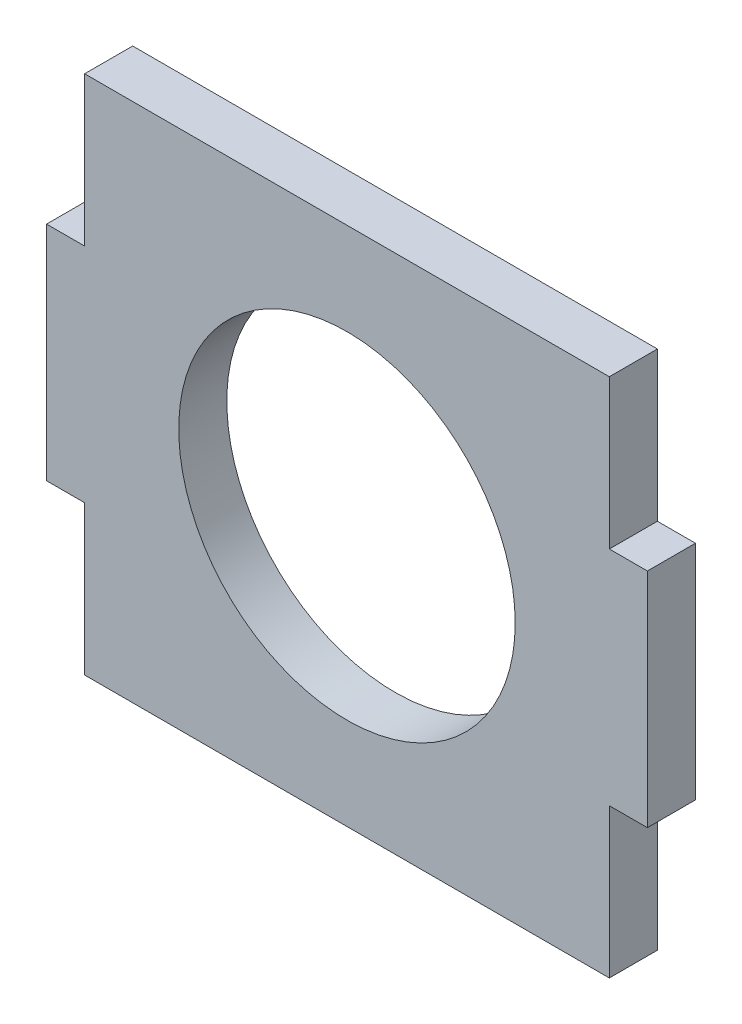
ISO-10303-21;
HEADER;
FILE_DESCRIPTION(('STEP AP214'),'2;1');
FILE_NAME('part.step','',(''),(''),'','','');
FILE_SCHEMA(('AUTOMOTIVE_DESIGN { 1 0 10303 214 1 1 1 1 }'));
ENDSEC;
DATA;
#1=APPLICATION_CONTEXT('core data for automotive mechanical design processes');
#2=APPLICATION_PROTOCOL_DEFINITION('international standard','automotive_design',2000,#1);
#3=PRODUCT_CONTEXT('',#1,'mechanical');
#4=PRODUCT('Part','Part','',(#3));
#5=PRODUCT_RELATED_PRODUCT_CATEGORY('part','',(#4));
#6=PRODUCT_DEFINITION_FORMATION('','',#4);
#7=PRODUCT_DEFINITION_CONTEXT('part definition',#1,'design');
#8=PRODUCT_DEFINITION('design','',#6,#7);
#9=PRODUCT_DEFINITION_SHAPE('','',#8);
#10=(LENGTH_UNIT() NAMED_UNIT(*) SI_UNIT(.MILLI.,.METRE.));
#11=(NAMED_UNIT(*) PLANE_ANGLE_UNIT() SI_UNIT($,.RADIAN.));
#12=(NAMED_UNIT(*) SI_UNIT($,.STERADIAN.) SOLID_ANGLE_UNIT());
#13=UNCERTAINTY_MEASURE_WITH_UNIT(LENGTH_MEASURE(1.E-05),#10,'distance_accuracy_value','');
#14=(GEOMETRIC_REPRESENTATION_CONTEXT(3) GLOBAL_UNCERTAINTY_ASSIGNED_CONTEXT((#13)) GLOBAL_UNIT_ASSIGNED_CONTEXT((#10,
#11,#12)) REPRESENTATION_CONTEXT('',''));
#15=CARTESIAN_POINT('',(0.,0.,0.));
#16=DIRECTION('',(0.,0.,1.));
#17=DIRECTION('',(1.,0.,0.));
#18=AXIS2_PLACEMENT_3D('',#15,#16,#17);
#19=CARTESIAN_POINT('',(-7.5,6.5,1.2));
#20=DIRECTION('',(1.,0.,0.));
#21=DIRECTION('',(0.,1.,0.));
#22=AXIS2_PLACEMENT_3D('',#19,#20,#21);
#23=PLANE('',#22);
#24=DIRECTION('',(0.,-1.,0.));
#25=VECTOR('',#24,1.);
#26=CARTESIAN_POINT('',(-7.5,6.5,1.2));
#27=LINE('',#26,#25);
#28=CARTESIAN_POINT('',(-7.5,2.775,1.2));
#29=VERTEX_POINT('',#28);
#30=CARTESIAN_POINT('',(-7.5,-2.775,1.2));
#31=VERTEX_POINT('',#30);
#32=EDGE_CURVE('E146',#29,#31,#27,.T.);
#33=ORIENTED_EDGE('',*,*,#32,.F.);
#34=DIRECTION('',(0.,0.,1.));
#35=VECTOR('',#34,1.);
#36=CARTESIAN_POINT('',(-7.5,2.775,-0.000999999999999916));
#37=LINE('',#36,#35);
#38=CARTESIAN_POINT('',(-7.5,2.775,0.));
#39=VERTEX_POINT('',#38);
#40=EDGE_CURVE('E133',#39,#29,#37,.T.);
#41=ORIENTED_EDGE('',*,*,#40,.F.);
#42=DIRECTION('',(0.,-1.,0.));
#43=VECTOR('',#42,1.);
#44=CARTESIAN_POINT('',(-7.5,6.5,0.));
#45=LINE('',#44,#43);
#46=CARTESIAN_POINT('',(-7.5,-2.775,0.));
#47=VERTEX_POINT('',#46);
#48=EDGE_CURVE('E145',#39,#47,#45,.T.);
#49=ORIENTED_EDGE('',*,*,#48,.T.);
#50=DIRECTION('',(0.,0.,1.));
#51=VECTOR('',#50,1.);
#52=CARTESIAN_POINT('',(-7.5,-2.775,-0.000999999999999916));
#53=LINE('',#52,#51);
#54=EDGE_CURVE('E396',#47,#31,#53,.T.);
#55=ORIENTED_EDGE('',*,*,#54,.T.);
#56=EDGE_LOOP('',(#33,#41,#49,#55));
#57=FACE_BOUND('',#56,.T.);
#58=ADVANCED_FACE('F38',(#57),#23,.F.);
#59=CARTESIAN_POINT('',(-7.5,-6.5,1.2));
#60=DIRECTION('',(0.,1.,0.));
#61=DIRECTION('',(0.,0.,1.));
#62=AXIS2_PLACEMENT_3D('',#59,#60,#61);
#63=PLANE('',#62);
#64=DIRECTION('',(1.,0.,0.));
#65=VECTOR('',#64,1.);
#66=CARTESIAN_POINT('',(-7.5,-6.5,1.2));
#67=LINE('',#66,#65);
#68=CARTESIAN_POINT('',(-6.55,-6.5,1.2));
#69=VERTEX_POINT('',#68);
#70=CARTESIAN_POINT('',(6.55,-6.5,1.2));
#71=VERTEX_POINT('',#70);
#72=EDGE_CURVE('E180',#69,#71,#67,.T.);
#73=ORIENTED_EDGE('',*,*,#72,.F.);
#74=DIRECTION('',(0.,0.,1.));
#75=VECTOR('',#74,1.);
#76=CARTESIAN_POINT('',(-6.55,-6.5,-0.000999999999999916));
#77=LINE('',#76,#75);
#78=CARTESIAN_POINT('',(-6.55,-6.5,0.));
#79=VERTEX_POINT('',#78);
#80=EDGE_CURVE('E395',#79,#69,#77,.T.);
#81=ORIENTED_EDGE('',*,*,#80,.F.);
#82=DIRECTION('',(1.,0.,0.));
#83=VECTOR('',#82,1.);
#84=CARTESIAN_POINT('',(-7.5,-6.5,0.));
#85=LINE('',#84,#83);
#86=CARTESIAN_POINT('',(6.55,-6.5,0.));
#87=VERTEX_POINT('',#86);
#88=EDGE_CURVE('E153',#79,#87,#85,.T.);
#89=ORIENTED_EDGE('',*,*,#88,.T.);
#90=DIRECTION('',(0.,0.,1.));
#91=VECTOR('',#90,1.);
#92=CARTESIAN_POINT('',(6.55,-6.5,-0.000999999999999916));
#93=LINE('',#92,#91);
#94=EDGE_CURVE('E412',#87,#71,#93,.T.);
#95=ORIENTED_EDGE('',*,*,#94,.T.);
#96=EDGE_LOOP('',(#73,#81,#89,#95));
#97=FACE_BOUND('',#96,.T.);
#98=ADVANCED_FACE('F214',(#97),#63,.F.);
#99=CARTESIAN_POINT('',(7.5,6.5,1.2));
#100=DIRECTION('',(-1.,0.,0.));
#101=DIRECTION('',(0.,0.,1.));
#102=AXIS2_PLACEMENT_3D('',#99,#100,#101);
#103=PLANE('',#102);
#104=DIRECTION('',(0.,1.,0.));
#105=VECTOR('',#104,1.);
#106=CARTESIAN_POINT('',(7.5,6.5,1.2));
#107=LINE('',#106,#105);
#108=CARTESIAN_POINT('',(7.5,-2.775,1.2));
#109=VERTEX_POINT('',#108);
#110=CARTESIAN_POINT('',(7.5,2.775,1.2));
#111=VERTEX_POINT('',#110);
#112=EDGE_CURVE('E47',#109,#111,#107,.T.);
#113=ORIENTED_EDGE('',*,*,#112,.F.);
#114=DIRECTION('',(0.,0.,1.));
#115=VECTOR('',#114,1.);
#116=CARTESIAN_POINT('',(7.5,-2.775,-0.000999999999999916));
#117=LINE('',#116,#115);
#118=CARTESIAN_POINT('',(7.5,-2.775,0.));
#119=VERTEX_POINT('',#118);
#120=EDGE_CURVE('E411',#119,#109,#117,.T.);
#121=ORIENTED_EDGE('',*,*,#120,.F.);
#122=DIRECTION('',(0.,1.,0.));
#123=VECTOR('',#122,1.);
#124=CARTESIAN_POINT('',(7.5,6.5,0.));
#125=LINE('',#124,#123);
#126=CARTESIAN_POINT('',(7.5,2.775,0.));
#127=VERTEX_POINT('',#126);
#128=EDGE_CURVE('E158',#119,#127,#125,.T.);
#129=ORIENTED_EDGE('',*,*,#128,.T.);
#130=DIRECTION('',(0.,0.,1.));
#131=VECTOR('',#130,1.);
#132=CARTESIAN_POINT('',(7.5,2.775,-0.000999999999999916));
#133=LINE('',#132,#131);
#134=EDGE_CURVE('E154',#127,#111,#133,.T.);
#135=ORIENTED_EDGE('',*,*,#134,.T.);
#136=EDGE_LOOP('',(#113,#121,#129,#135));
#137=FACE_BOUND('',#136,.T.);
#138=ADVANCED_FACE('F211',(#137),#103,.F.);
#139=CARTESIAN_POINT('',(-7.5,6.5,1.2));
#140=DIRECTION('',(0.,-1.,0.));
#141=DIRECTION('',(0.,0.,-1.));
#142=AXIS2_PLACEMENT_3D('',#139,#140,#141);
#143=PLANE('',#142);
#144=DIRECTION('',(-1.,0.,0.));
#145=VECTOR('',#144,1.);
#146=CARTESIAN_POINT('',(-7.5,6.5,0.));
#147=LINE('',#146,#145);
#148=CARTESIAN_POINT('',(6.55,6.5,0.));
#149=VERTEX_POINT('',#148);
#150=CARTESIAN_POINT('',(-6.55,6.5,0.));
#151=VERTEX_POINT('',#150);
#152=EDGE_CURVE('E41',#149,#151,#147,.T.);
#153=ORIENTED_EDGE('',*,*,#152,.T.);
#154=DIRECTION('',(0.,0.,1.));
#155=VECTOR('',#154,1.);
#156=CARTESIAN_POINT('',(-6.55,6.5,-0.000999999999999916));
#157=LINE('',#156,#155);
#158=CARTESIAN_POINT('',(-6.55,6.5,1.2));
#159=VERTEX_POINT('',#158);
#160=EDGE_CURVE('E140',#151,#159,#157,.T.);
#161=ORIENTED_EDGE('',*,*,#160,.T.);
#162=DIRECTION('',(-1.,0.,0.));
#163=VECTOR('',#162,1.);
#164=CARTESIAN_POINT('',(-7.5,6.5,1.2));
#165=LINE('',#164,#163);
#166=CARTESIAN_POINT('',(6.55,6.5,1.2));
#167=VERTEX_POINT('',#166);
#168=EDGE_CURVE('E11',#167,#159,#165,.T.);
#169=ORIENTED_EDGE('',*,*,#168,.F.);
#170=DIRECTION('',(0.,0.,1.));
#171=VECTOR('',#170,1.);
#172=CARTESIAN_POINT('',(6.55,6.5,-0.000999999999999916));
#173=LINE('',#172,#171);
#174=EDGE_CURVE('E189',#149,#167,#173,.T.);
#175=ORIENTED_EDGE('',*,*,#174,.F.);
#176=EDGE_LOOP('',(#153,#161,#169,#175));
#177=FACE_BOUND('',#176,.T.);
#178=ADVANCED_FACE('F213',(#177),#143,.F.);
#179=CARTESIAN_POINT('',(0.,0.,1.2));
#180=DIRECTION('',(0.,0.,1.));
#181=DIRECTION('',(1.,0.,0.));
#182=AXIS2_PLACEMENT_3D('',#179,#180,#181);
#183=PLANE('',#182);
#184=CARTESIAN_POINT('',(0.,0.,1.2));
#185=DIRECTION('',(0.,0.,1.));
#186=DIRECTION('',(1.,0.,0.));
#187=AXIS2_PLACEMENT_3D('',#184,#185,#186);
#188=CIRCLE('',#187,4.2);
#189=CARTESIAN_POINT('',(4.2,0.,1.2));
#190=VERTEX_POINT('',#189);
#191=EDGE_CURVE('E365',#190,#190,#188,.T.);
#192=ORIENTED_EDGE('',*,*,#191,.F.);
#193=EDGE_LOOP('',(#192));
#194=FACE_BOUND('',#193,.T.);
#195=DIRECTION('',(0.,1.,0.));
#196=VECTOR('',#195,1.);
#197=CARTESIAN_POINT('',(-6.55,6.5,1.2));
#198=LINE('',#197,#196);
#199=CARTESIAN_POINT('',(-6.55,2.775,1.2));
#200=VERTEX_POINT('',#199);
#201=EDGE_CURVE('E148',#200,#159,#198,.T.);
#202=ORIENTED_EDGE('',*,*,#201,.F.);
#203=DIRECTION('',(1.,0.,0.));
#204=VECTOR('',#203,1.);
#205=CARTESIAN_POINT('',(-7.5,2.775,1.2));
#206=LINE('',#205,#204);
#207=EDGE_CURVE('E372',#29,#200,#206,.T.);
#208=ORIENTED_EDGE('',*,*,#207,.F.);
#209=ORIENTED_EDGE('',*,*,#32,.T.);
#210=DIRECTION('',(-1.,0.,0.));
#211=VECTOR('',#210,1.);
#212=CARTESIAN_POINT('',(-7.5,-2.775,1.2));
#213=LINE('',#212,#211);
#214=CARTESIAN_POINT('',(-6.55,-2.775,1.2));
#215=VERTEX_POINT('',#214);
#216=EDGE_CURVE('E392',#215,#31,#213,.T.);
#217=ORIENTED_EDGE('',*,*,#216,.F.);
#218=DIRECTION('',(0.,1.,0.));
#219=VECTOR('',#218,1.);
#220=CARTESIAN_POINT('',(-6.55,-6.5,1.2));
#221=LINE('',#220,#219);
#222=EDGE_CURVE('E388',#69,#215,#221,.T.);
#223=ORIENTED_EDGE('',*,*,#222,.F.);
#224=ORIENTED_EDGE('',*,*,#72,.T.);
#225=DIRECTION('',(0.,-1.,0.));
#226=VECTOR('',#225,1.);
#227=CARTESIAN_POINT('',(6.55,-6.5,1.2));
#228=LINE('',#227,#226);
#229=CARTESIAN_POINT('',(6.55,-2.775,1.2));
#230=VERTEX_POINT('',#229);
#231=EDGE_CURVE('E407',#230,#71,#228,.T.);
#232=ORIENTED_EDGE('',*,*,#231,.F.);
#233=DIRECTION('',(-1.,0.,0.));
#234=VECTOR('',#233,1.);
#235=CARTESIAN_POINT('',(7.5,-2.775,1.2));
#236=LINE('',#235,#234);
#237=EDGE_CURVE('E203',#109,#230,#236,.T.);
#238=ORIENTED_EDGE('',*,*,#237,.F.);
#239=ORIENTED_EDGE('',*,*,#112,.T.);
#240=DIRECTION('',(1.,0.,0.));
#241=VECTOR('',#240,1.);
#242=CARTESIAN_POINT('',(7.5,2.775,1.2));
#243=LINE('',#242,#241);
#244=CARTESIAN_POINT('',(6.55,2.775,1.2));
#245=VERTEX_POINT('',#244);
#246=EDGE_CURVE('E200',#245,#111,#243,.T.);
#247=ORIENTED_EDGE('',*,*,#246,.F.);
#248=DIRECTION('',(0.,-1.,0.));
#249=VECTOR('',#248,1.);
#250=CARTESIAN_POINT('',(6.55,6.5,1.2));
#251=LINE('',#250,#249);
#252=EDGE_CURVE('E209',#167,#245,#251,.T.);
#253=ORIENTED_EDGE('',*,*,#252,.F.);
#254=ORIENTED_EDGE('',*,*,#168,.T.);
#255=EDGE_LOOP('',(#202,#208,#209,#217,#223,#224,#232,#238,#239,#247,#253,#254));
#256=FACE_BOUND('',#255,.T.);
#257=ADVANCED_FACE('F198',(#194,#256),#183,.T.);
#258=CARTESIAN_POINT('',(0.,0.,0.));
#259=DIRECTION('',(0.,0.,1.));
#260=DIRECTION('',(1.,0.,0.));
#261=AXIS2_PLACEMENT_3D('',#258,#259,#260);
#262=PLANE('',#261);
#263=CARTESIAN_POINT('',(0.,0.,0.));
#264=DIRECTION('',(0.,0.,1.));
#265=DIRECTION('',(1.,0.,0.));
#266=AXIS2_PLACEMENT_3D('',#263,#264,#265);
#267=CIRCLE('',#266,4.2);
#268=CARTESIAN_POINT('',(4.2,0.,0.));
#269=VERTEX_POINT('',#268);
#270=EDGE_CURVE('E368',#269,#269,#267,.F.);
#271=ORIENTED_EDGE('',*,*,#270,.F.);
#272=EDGE_LOOP('',(#271));
#273=FACE_BOUND('',#272,.T.);
#274=DIRECTION('',(-1.,0.,0.));
#275=VECTOR('',#274,1.);
#276=CARTESIAN_POINT('',(-7.5,2.775,0.));
#277=LINE('',#276,#275);
#278=CARTESIAN_POINT('',(-6.55,2.775,0.));
#279=VERTEX_POINT('',#278);
#280=EDGE_CURVE('E129',#279,#39,#277,.T.);
#281=ORIENTED_EDGE('',*,*,#280,.F.);
#282=DIRECTION('',(0.,-1.,0.));
#283=VECTOR('',#282,1.);
#284=CARTESIAN_POINT('',(-6.55,6.5,0.));
#285=LINE('',#284,#283);
#286=EDGE_CURVE('E55',#151,#279,#285,.T.);
#287=ORIENTED_EDGE('',*,*,#286,.F.);
#288=ORIENTED_EDGE('',*,*,#152,.F.);
#289=DIRECTION('',(0.,1.,0.));
#290=VECTOR('',#289,1.);
#291=CARTESIAN_POINT('',(6.55,6.5,0.));
#292=LINE('',#291,#290);
#293=CARTESIAN_POINT('',(6.55,2.775,0.));
#294=VERTEX_POINT('',#293);
#295=EDGE_CURVE('E423',#294,#149,#292,.T.);
#296=ORIENTED_EDGE('',*,*,#295,.F.);
#297=DIRECTION('',(-1.,0.,0.));
#298=VECTOR('',#297,1.);
#299=CARTESIAN_POINT('',(7.5,2.775,0.));
#300=LINE('',#299,#298);
#301=EDGE_CURVE('E426',#127,#294,#300,.T.);
#302=ORIENTED_EDGE('',*,*,#301,.F.);
#303=ORIENTED_EDGE('',*,*,#128,.F.);
#304=DIRECTION('',(1.,0.,0.));
#305=VECTOR('',#304,1.);
#306=CARTESIAN_POINT('',(7.5,-2.775,0.));
#307=LINE('',#306,#305);
#308=CARTESIAN_POINT('',(6.55,-2.775,0.));
#309=VERTEX_POINT('',#308);
#310=EDGE_CURVE('E416',#309,#119,#307,.T.);
#311=ORIENTED_EDGE('',*,*,#310,.F.);
#312=DIRECTION('',(0.,1.,0.));
#313=VECTOR('',#312,1.);
#314=CARTESIAN_POINT('',(6.55,-6.5,0.));
#315=LINE('',#314,#313);
#316=EDGE_CURVE('E399',#87,#309,#315,.T.);
#317=ORIENTED_EDGE('',*,*,#316,.F.);
#318=ORIENTED_EDGE('',*,*,#88,.F.);
#319=DIRECTION('',(0.,-1.,0.));
#320=VECTOR('',#319,1.);
#321=CARTESIAN_POINT('',(-6.55,-6.5,0.));
#322=LINE('',#321,#320);
#323=CARTESIAN_POINT('',(-6.55,-2.775,0.));
#324=VERTEX_POINT('',#323);
#325=EDGE_CURVE('E139',#324,#79,#322,.T.);
#326=ORIENTED_EDGE('',*,*,#325,.F.);
#327=DIRECTION('',(1.,0.,0.));
#328=VECTOR('',#327,1.);
#329=CARTESIAN_POINT('',(-7.5,-2.775,0.));
#330=LINE('',#329,#328);
#331=EDGE_CURVE('E63',#47,#324,#330,.T.);
#332=ORIENTED_EDGE('',*,*,#331,.F.);
#333=ORIENTED_EDGE('',*,*,#48,.F.);
#334=EDGE_LOOP('',(#281,#287,#288,#296,#302,#303,#311,#317,#318,#326,#332,#333));
#335=FACE_BOUND('',#334,.T.);
#336=ADVANCED_FACE('F150',(#273,#335),#262,.F.);
#337=CARTESIAN_POINT('',(7.5,2.775,-0.000999999999999916));
#338=DIRECTION('',(0.,-1.,0.));
#339=DIRECTION('',(0.,0.,-1.));
#340=AXIS2_PLACEMENT_3D('',#337,#338,#339);
#341=PLANE('',#340);
#342=ORIENTED_EDGE('',*,*,#301,.T.);
#343=DIRECTION('',(0.,0.,1.));
#344=VECTOR('',#343,1.);
#345=CARTESIAN_POINT('',(6.55,2.775,-0.000999999999999916));
#346=LINE('',#345,#344);
#347=EDGE_CURVE('E162',#294,#245,#346,.T.);
#348=ORIENTED_EDGE('',*,*,#347,.T.);
#349=ORIENTED_EDGE('',*,*,#246,.T.);
#350=ORIENTED_EDGE('',*,*,#134,.F.);
#351=EDGE_LOOP('',(#342,#348,#349,#350));
#352=FACE_BOUND('',#351,.T.);
#353=ADVANCED_FACE('F205',(#352),#341,.F.);
#354=CARTESIAN_POINT('',(6.55,6.5,-0.000999999999999916));
#355=DIRECTION('',(-1.,0.,0.));
#356=DIRECTION('',(0.,0.,1.));
#357=AXIS2_PLACEMENT_3D('',#354,#355,#356);
#358=PLANE('',#357);
#359=ORIENTED_EDGE('',*,*,#295,.T.);
#360=ORIENTED_EDGE('',*,*,#174,.T.);
#361=ORIENTED_EDGE('',*,*,#252,.T.);
#362=ORIENTED_EDGE('',*,*,#347,.F.);
#363=EDGE_LOOP('',(#359,#360,#361,#362));
#364=FACE_BOUND('',#363,.T.);
#365=ADVANCED_FACE('F261',(#364),#358,.F.);
#366=CARTESIAN_POINT('',(6.55,-6.5,-0.000999999999999916));
#367=DIRECTION('',(-1.,0.,0.));
#368=DIRECTION('',(0.,0.,1.));
#369=AXIS2_PLACEMENT_3D('',#366,#367,#368);
#370=PLANE('',#369);
#371=ORIENTED_EDGE('',*,*,#316,.T.);
#372=DIRECTION('',(0.,0.,1.));
#373=VECTOR('',#372,1.);
#374=CARTESIAN_POINT('',(6.55,-2.775,-0.000999999999999916));
#375=LINE('',#374,#373);
#376=EDGE_CURVE('E417',#309,#230,#375,.T.);
#377=ORIENTED_EDGE('',*,*,#376,.T.);
#378=ORIENTED_EDGE('',*,*,#231,.T.);
#379=ORIENTED_EDGE('',*,*,#94,.F.);
#380=EDGE_LOOP('',(#371,#377,#378,#379));
#381=FACE_BOUND('',#380,.T.);
#382=ADVANCED_FACE('F269',(#381),#370,.F.);
#383=CARTESIAN_POINT('',(7.5,-2.775,-0.000999999999999916));
#384=DIRECTION('',(0.,1.,0.));
#385=DIRECTION('',(0.,0.,1.));
#386=AXIS2_PLACEMENT_3D('',#383,#384,#385);
#387=PLANE('',#386);
#388=ORIENTED_EDGE('',*,*,#310,.T.);
#389=ORIENTED_EDGE('',*,*,#120,.T.);
#390=ORIENTED_EDGE('',*,*,#237,.T.);
#391=ORIENTED_EDGE('',*,*,#376,.F.);
#392=EDGE_LOOP('',(#388,#389,#390,#391));
#393=FACE_BOUND('',#392,.T.);
#394=ADVANCED_FACE('F278',(#393),#387,.F.);
#395=CARTESIAN_POINT('',(-7.5,-2.775,-0.000999999999999916));
#396=DIRECTION('',(0.,1.,0.));
#397=DIRECTION('',(0.,0.,1.));
#398=AXIS2_PLACEMENT_3D('',#395,#396,#397);
#399=PLANE('',#398);
#400=ORIENTED_EDGE('',*,*,#331,.T.);
#401=DIRECTION('',(0.,0.,1.));
#402=VECTOR('',#401,1.);
#403=CARTESIAN_POINT('',(-6.55,-2.775,-0.000999999999999916));
#404=LINE('',#403,#402);
#405=EDGE_CURVE('E400',#324,#215,#404,.T.);
#406=ORIENTED_EDGE('',*,*,#405,.T.);
#407=ORIENTED_EDGE('',*,*,#216,.T.);
#408=ORIENTED_EDGE('',*,*,#54,.F.);
#409=EDGE_LOOP('',(#400,#406,#407,#408));
#410=FACE_BOUND('',#409,.T.);
#411=ADVANCED_FACE('F287',(#410),#399,.F.);
#412=CARTESIAN_POINT('',(-6.55,-6.5,-0.000999999999999916));
#413=DIRECTION('',(1.,0.,0.));
#414=DIRECTION('',(0.,1.,0.));
#415=AXIS2_PLACEMENT_3D('',#412,#413,#414);
#416=PLANE('',#415);
#417=ORIENTED_EDGE('',*,*,#325,.T.);
#418=ORIENTED_EDGE('',*,*,#80,.T.);
#419=ORIENTED_EDGE('',*,*,#222,.T.);
#420=ORIENTED_EDGE('',*,*,#405,.F.);
#421=EDGE_LOOP('',(#417,#418,#419,#420));
#422=FACE_BOUND('',#421,.T.);
#423=ADVANCED_FACE('F296',(#422),#416,.F.);
#424=CARTESIAN_POINT('',(-6.55,6.5,-0.000999999999999916));
#425=DIRECTION('',(1.,0.,0.));
#426=DIRECTION('',(0.,1.,0.));
#427=AXIS2_PLACEMENT_3D('',#424,#425,#426);
#428=PLANE('',#427);
#429=ORIENTED_EDGE('',*,*,#286,.T.);
#430=DIRECTION('',(0.,0.,1.));
#431=VECTOR('',#430,1.);
#432=CARTESIAN_POINT('',(-6.55,2.775,-0.000999999999999916));
#433=LINE('',#432,#431);
#434=EDGE_CURVE('E135',#279,#200,#433,.T.);
#435=ORIENTED_EDGE('',*,*,#434,.T.);
#436=ORIENTED_EDGE('',*,*,#201,.T.);
#437=ORIENTED_EDGE('',*,*,#160,.F.);
#438=EDGE_LOOP('',(#429,#435,#436,#437));
#439=FACE_BOUND('',#438,.T.);
#440=ADVANCED_FACE('F304',(#439),#428,.F.);
#441=CARTESIAN_POINT('',(-7.5,2.775,-0.000999999999999916));
#442=DIRECTION('',(0.,-1.,0.));
#443=DIRECTION('',(0.,0.,-1.));
#444=AXIS2_PLACEMENT_3D('',#441,#442,#443);
#445=PLANE('',#444);
#446=ORIENTED_EDGE('',*,*,#280,.T.);
#447=ORIENTED_EDGE('',*,*,#40,.T.);
#448=ORIENTED_EDGE('',*,*,#207,.T.);
#449=ORIENTED_EDGE('',*,*,#434,.F.);
#450=EDGE_LOOP('',(#446,#447,#448,#449));
#451=FACE_BOUND('',#450,.T.);
#452=ADVANCED_FACE('F131',(#451),#445,.F.);
#453=CARTESIAN_POINT('',(0.,0.,-0.000999999999999916));
#454=DIRECTION('',(0.,0.,1.));
#455=DIRECTION('',(1.,0.,0.));
#456=AXIS2_PLACEMENT_3D('',#453,#454,#455);
#457=CYLINDRICAL_SURFACE('',#456,4.2);
#458=ORIENTED_EDGE('',*,*,#191,.T.);
#459=EDGE_LOOP('',(#458));
#460=FACE_BOUND('',#459,.T.);
#461=ORIENTED_EDGE('',*,*,#270,.T.);
#462=EDGE_LOOP('',(#461));
#463=FACE_BOUND('',#462,.T.);
#464=ADVANCED_FACE('F319',(#460,#463),#457,.F.);
#465=CLOSED_SHELL('',(#58,#98,#138,#178,#257,#336,#353,#365,#382,#394,#411,#423,#440,#452,#464));
#466=MANIFOLD_SOLID_BREP('B2',#465);
#467=ADVANCED_BREP_SHAPE_REPRESENTATION('',(#18,#466),#14);
#468=SHAPE_DEFINITION_REPRESENTATION(#9,#467);
ENDSEC;
END-ISO-10303-21;
